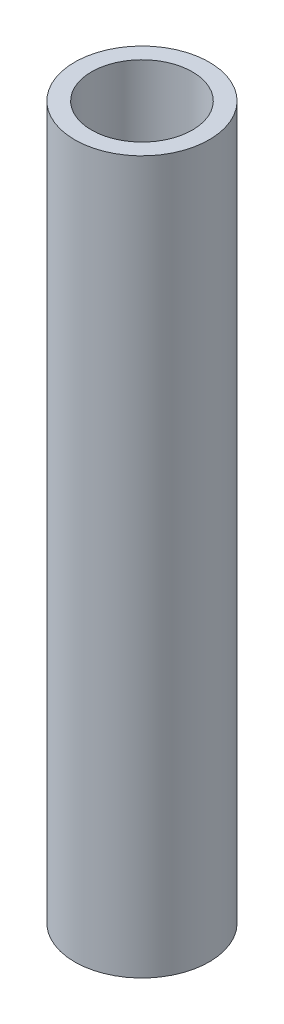
ISO-10303-21;
HEADER;
FILE_DESCRIPTION(('STEP AP214'),'2;1');
FILE_NAME('part.step','',(''),(''),'','','');
FILE_SCHEMA(('AUTOMOTIVE_DESIGN { 1 0 10303 214 1 1 1 1 }'));
ENDSEC;
DATA;
#1=APPLICATION_CONTEXT('core data for automotive mechanical design processes');
#2=APPLICATION_PROTOCOL_DEFINITION('international standard','automotive_design',2000,#1);
#3=PRODUCT_CONTEXT('',#1,'mechanical');
#4=PRODUCT('Part','Part','',(#3));
#5=PRODUCT_RELATED_PRODUCT_CATEGORY('part','',(#4));
#6=PRODUCT_DEFINITION_FORMATION('','',#4);
#7=PRODUCT_DEFINITION_CONTEXT('part definition',#1,'design');
#8=PRODUCT_DEFINITION('design','',#6,#7);
#9=PRODUCT_DEFINITION_SHAPE('','',#8);
#10=(LENGTH_UNIT() NAMED_UNIT(*) SI_UNIT(.MILLI.,.METRE.));
#11=(NAMED_UNIT(*) PLANE_ANGLE_UNIT() SI_UNIT($,.RADIAN.));
#12=(NAMED_UNIT(*) SI_UNIT($,.STERADIAN.) SOLID_ANGLE_UNIT());
#13=UNCERTAINTY_MEASURE_WITH_UNIT(LENGTH_MEASURE(1.E-05),#10,'distance_accuracy_value','');
#14=(GEOMETRIC_REPRESENTATION_CONTEXT(3) GLOBAL_UNCERTAINTY_ASSIGNED_CONTEXT((#13)) GLOBAL_UNIT_ASSIGNED_CONTEXT((#10,
#11,#12)) REPRESENTATION_CONTEXT('',''));
#15=CARTESIAN_POINT('',(0.,0.,0.));
#16=DIRECTION('',(0.,0.,1.));
#17=DIRECTION('',(1.,0.,0.));
#18=AXIS2_PLACEMENT_3D('',#15,#16,#17);
#19=CARTESIAN_POINT('',(0.,127.,0.));
#20=DIRECTION('',(0.,-1.,0.));
#21=DIRECTION('',(0.,0.,-1.));
#22=AXIS2_PLACEMENT_3D('',#19,#20,#21);
#23=CYLINDRICAL_SURFACE('',#22,12.);
#24=CARTESIAN_POINT('',(0.,127.,0.));
#25=DIRECTION('',(0.,1.,0.));
#26=DIRECTION('',(0.,0.,1.));
#27=AXIS2_PLACEMENT_3D('',#24,#25,#26);
#28=CIRCLE('',#27,12.);
#29=CARTESIAN_POINT('',(0.,127.,12.));
#30=VERTEX_POINT('',#29);
#31=EDGE_CURVE('E10',#30,#30,#28,.T.);
#32=ORIENTED_EDGE('',*,*,#31,.F.);
#33=EDGE_LOOP('',(#32));
#34=FACE_BOUND('',#33,.T.);
#35=CARTESIAN_POINT('',(0.,0.,0.));
#36=DIRECTION('',(0.,1.,0.));
#37=DIRECTION('',(0.,0.,1.));
#38=AXIS2_PLACEMENT_3D('',#35,#36,#37);
#39=CIRCLE('',#38,12.);
#40=CARTESIAN_POINT('',(0.,0.,12.));
#41=VERTEX_POINT('',#40);
#42=EDGE_CURVE('E42',#41,#41,#39,.T.);
#43=ORIENTED_EDGE('',*,*,#42,.T.);
#44=EDGE_LOOP('',(#43));
#45=FACE_BOUND('',#44,.T.);
#46=ADVANCED_FACE('F40',(#34,#45),#23,.T.);
#47=CARTESIAN_POINT('',(0.,127.,0.));
#48=DIRECTION('',(0.,1.,0.));
#49=DIRECTION('',(0.,0.,1.));
#50=AXIS2_PLACEMENT_3D('',#47,#48,#49);
#51=PLANE('',#50);
#52=CARTESIAN_POINT('',(0.,127.,0.));
#53=DIRECTION('',(0.,1.,0.));
#54=DIRECTION('',(0.,0.,1.));
#55=AXIS2_PLACEMENT_3D('',#52,#53,#54);
#56=CIRCLE('',#55,9.);
#57=CARTESIAN_POINT('',(0.,127.,9.));
#58=VERTEX_POINT('',#57);
#59=EDGE_CURVE('E49',#58,#58,#56,.T.);
#60=ORIENTED_EDGE('',*,*,#59,.F.);
#61=EDGE_LOOP('',(#60));
#62=FACE_BOUND('',#61,.T.);
#63=ORIENTED_EDGE('',*,*,#31,.T.);
#64=EDGE_LOOP('',(#63));
#65=FACE_BOUND('',#64,.T.);
#66=ADVANCED_FACE('F68',(#62,#65),#51,.T.);
#67=CARTESIAN_POINT('',(0.,0.,0.));
#68=DIRECTION('',(0.,1.,0.));
#69=DIRECTION('',(0.,0.,1.));
#70=AXIS2_PLACEMENT_3D('',#67,#68,#69);
#71=PLANE('',#70);
#72=CARTESIAN_POINT('',(0.,0.,0.));
#73=DIRECTION('',(0.,1.,0.));
#74=DIRECTION('',(0.,0.,1.));
#75=AXIS2_PLACEMENT_3D('',#72,#73,#74);
#76=CIRCLE('',#75,9.);
#77=CARTESIAN_POINT('',(0.,0.,9.));
#78=VERTEX_POINT('',#77);
#79=EDGE_CURVE('E37',#78,#78,#76,.T.);
#80=ORIENTED_EDGE('',*,*,#79,.T.);
#81=EDGE_LOOP('',(#80));
#82=FACE_BOUND('',#81,.T.);
#83=ORIENTED_EDGE('',*,*,#42,.F.);
#84=EDGE_LOOP('',(#83));
#85=FACE_BOUND('',#84,.T.);
#86=ADVANCED_FACE('F60',(#82,#85),#71,.F.);
#87=CARTESIAN_POINT('',(0.,-127.,0.));
#88=DIRECTION('',(0.,1.,0.));
#89=DIRECTION('',(0.,0.,1.));
#90=AXIS2_PLACEMENT_3D('',#87,#88,#89);
#91=CYLINDRICAL_SURFACE('',#90,9.);
#92=ORIENTED_EDGE('',*,*,#59,.T.);
#93=EDGE_LOOP('',(#92));
#94=FACE_BOUND('',#93,.T.);
#95=ORIENTED_EDGE('',*,*,#79,.F.);
#96=EDGE_LOOP('',(#95));
#97=FACE_BOUND('',#96,.T.);
#98=ADVANCED_FACE('F58',(#94,#97),#91,.F.);
#99=CLOSED_SHELL('',(#46,#66,#86,#98));
#100=MANIFOLD_SOLID_BREP('B2',#99);
#101=ADVANCED_BREP_SHAPE_REPRESENTATION('',(#18,#100),#14);
#102=SHAPE_DEFINITION_REPRESENTATION(#9,#101);
ENDSEC;
END-ISO-10303-21;
